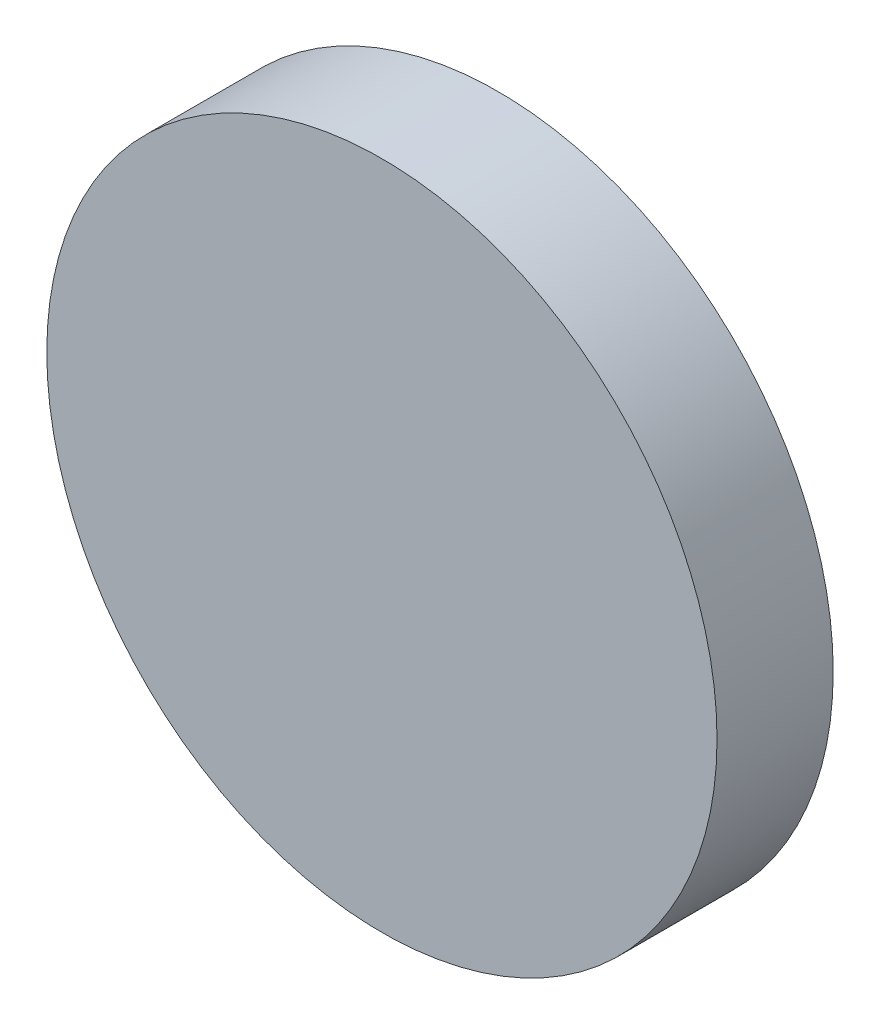
ISO-10303-21;
HEADER;
FILE_DESCRIPTION(('STEP AP214'),'2;1');
FILE_NAME('part.step','',(''),(''),'','','');
FILE_SCHEMA(('AUTOMOTIVE_DESIGN { 1 0 10303 214 1 1 1 1 }'));
ENDSEC;
DATA;
#1=APPLICATION_CONTEXT('core data for automotive mechanical design processes');
#2=APPLICATION_PROTOCOL_DEFINITION('international standard','automotive_design',2000,#1);
#3=PRODUCT_CONTEXT('',#1,'mechanical');
#4=PRODUCT('Part','Part','',(#3));
#5=PRODUCT_RELATED_PRODUCT_CATEGORY('part','',(#4));
#6=PRODUCT_DEFINITION_FORMATION('','',#4);
#7=PRODUCT_DEFINITION_CONTEXT('part definition',#1,'design');
#8=PRODUCT_DEFINITION('design','',#6,#7);
#9=PRODUCT_DEFINITION_SHAPE('','',#8);
#10=(LENGTH_UNIT() NAMED_UNIT(*) SI_UNIT(.MILLI.,.METRE.));
#11=(NAMED_UNIT(*) PLANE_ANGLE_UNIT() SI_UNIT($,.RADIAN.));
#12=(NAMED_UNIT(*) SI_UNIT($,.STERADIAN.) SOLID_ANGLE_UNIT());
#13=UNCERTAINTY_MEASURE_WITH_UNIT(LENGTH_MEASURE(1.E-05),#10,'distance_accuracy_value','');
#14=(GEOMETRIC_REPRESENTATION_CONTEXT(3) GLOBAL_UNCERTAINTY_ASSIGNED_CONTEXT((#13)) GLOBAL_UNIT_ASSIGNED_CONTEXT((#10,
#11,#12)) REPRESENTATION_CONTEXT('',''));
#15=CARTESIAN_POINT('',(0.,0.,0.));
#16=DIRECTION('',(0.,0.,1.));
#17=DIRECTION('',(1.,0.,0.));
#18=AXIS2_PLACEMENT_3D('',#15,#16,#17);
#19=CARTESIAN_POINT('',(0.,0.,3.81));
#20=DIRECTION('',(0.,0.,-1.));
#21=DIRECTION('',(-1.,0.,0.));
#22=AXIS2_PLACEMENT_3D('',#19,#20,#21);
#23=CYLINDRICAL_SURFACE('',#22,47.625);
#24=CARTESIAN_POINT('',(0.,0.,3.81));
#25=DIRECTION('',(0.,0.,1.));
#26=DIRECTION('',(1.,0.,0.));
#27=AXIS2_PLACEMENT_3D('',#24,#25,#26);
#28=CIRCLE('',#27,47.625);
#29=CARTESIAN_POINT('',(-47.625,0.,3.81));
#30=VERTEX_POINT('',#29);
#31=EDGE_CURVE('E10',#30,#30,#28,.T.);
#32=CARTESIAN_POINT('',(0.,0.,-12.7));
#33=DIRECTION('',(0.,0.,-1.));
#34=DIRECTION('',(-1.,0.,0.));
#35=AXIS2_PLACEMENT_3D('',#32,#33,#34);
#36=CIRCLE('',#35,47.625);
#37=CARTESIAN_POINT('',(-47.625,0.,-12.7));
#38=VERTEX_POINT('',#37);
#39=EDGE_CURVE('E39',#38,#38,#36,.T.);
#40=CARTESIAN_POINT('',(-47.625,0.,3.81));
#41=CARTESIAN_POINT('',(-47.625,0.,3.63802083333333));
#42=CARTESIAN_POINT('',(-47.625,0.,3.46604166666667));
#43=CARTESIAN_POINT('',(-47.625,0.,3.12208333333333));
#44=CARTESIAN_POINT('',(-47.625,0.,2.95010416666667));
#45=CARTESIAN_POINT('',(-47.625,0.,2.60614583333333));
#46=CARTESIAN_POINT('',(-47.625,0.,2.43416666666667));
#47=CARTESIAN_POINT('',(-47.625,0.,2.09020833333333));
#48=CARTESIAN_POINT('',(-47.625,0.,1.91822916666667));
#49=CARTESIAN_POINT('',(-47.625,0.,1.57427083333333));
#50=CARTESIAN_POINT('',(-47.625,0.,1.40229166666667));
#51=CARTESIAN_POINT('',(-47.625,0.,1.05833333333333));
#52=CARTESIAN_POINT('',(-47.625,0.,0.886354166666666));
#53=CARTESIAN_POINT('',(-47.625,0.,0.542395833333332));
#54=CARTESIAN_POINT('',(-47.625,0.,0.370416666666665));
#55=CARTESIAN_POINT('',(-47.625,0.,0.0264583333333322));
#56=CARTESIAN_POINT('',(-47.625,0.,-0.145520833333334));
#57=CARTESIAN_POINT('',(-47.625,0.,-0.489479166666667));
#58=CARTESIAN_POINT('',(-47.625,0.,-0.661458333333334));
#59=CARTESIAN_POINT('',(-47.625,0.,-1.00541666666667));
#60=CARTESIAN_POINT('',(-47.625,0.,-1.17739583333333));
#61=CARTESIAN_POINT('',(-47.625,0.,-1.52135416666667));
#62=CARTESIAN_POINT('',(-47.625,0.,-1.69333333333333));
#63=CARTESIAN_POINT('',(-47.625,0.,-2.03729166666667));
#64=CARTESIAN_POINT('',(-47.625,0.,-2.20927083333333));
#65=CARTESIAN_POINT('',(-47.625,0.,-2.55322916666667));
#66=CARTESIAN_POINT('',(-47.625,0.,-2.72520833333333));
#67=CARTESIAN_POINT('',(-47.625,0.,-3.06916666666667));
#68=CARTESIAN_POINT('',(-47.625,0.,-3.24114583333333));
#69=CARTESIAN_POINT('',(-47.625,0.,-3.58510416666667));
#70=CARTESIAN_POINT('',(-47.625,0.,-3.75708333333334));
#71=CARTESIAN_POINT('',(-47.625,0.,-4.10104166666667));
#72=CARTESIAN_POINT('',(-47.625,0.,-4.27302083333333));
#73=CARTESIAN_POINT('',(-47.625,0.,-4.61697916666667));
#74=CARTESIAN_POINT('',(-47.625,0.,-4.78895833333334));
#75=CARTESIAN_POINT('',(-47.625,0.,-5.13291666666667));
#76=CARTESIAN_POINT('',(-47.625,0.,-5.30489583333333));
#77=CARTESIAN_POINT('',(-47.625,0.,-5.64885416666667));
#78=CARTESIAN_POINT('',(-47.625,0.,-5.82083333333333));
#79=CARTESIAN_POINT('',(-47.625,0.,-6.16479166666667));
#80=CARTESIAN_POINT('',(-47.625,0.,-6.33677083333333));
#81=CARTESIAN_POINT('',(-47.625,0.,-6.68072916666667));
#82=CARTESIAN_POINT('',(-47.625,0.,-6.85270833333333));
#83=CARTESIAN_POINT('',(-47.625,0.,-7.19666666666667));
#84=CARTESIAN_POINT('',(-47.625,0.,-7.36864583333334));
#85=CARTESIAN_POINT('',(-47.625,0.,-7.71260416666667));
#86=CARTESIAN_POINT('',(-47.625,0.,-7.88458333333334));
#87=CARTESIAN_POINT('',(-47.625,0.,-8.22854166666667));
#88=CARTESIAN_POINT('',(-47.625,0.,-8.40052083333333));
#89=CARTESIAN_POINT('',(-47.625,0.,-8.74447916666667));
#90=CARTESIAN_POINT('',(-47.625,0.,-8.91645833333333));
#91=CARTESIAN_POINT('',(-47.625,0.,-9.26041666666667));
#92=CARTESIAN_POINT('',(-47.625,0.,-9.43239583333334));
#93=CARTESIAN_POINT('',(-47.625,0.,-9.77635416666667));
#94=CARTESIAN_POINT('',(-47.625,0.,-9.94833333333334));
#95=CARTESIAN_POINT('',(-47.625,0.,-10.2922916666667));
#96=CARTESIAN_POINT('',(-47.625,0.,-10.4642708333333));
#97=CARTESIAN_POINT('',(-47.625,0.,-10.8082291666667));
#98=CARTESIAN_POINT('',(-47.625,0.,-10.9802083333333));
#99=CARTESIAN_POINT('',(-47.625,0.,-11.3241666666667));
#100=CARTESIAN_POINT('',(-47.625,0.,-11.4961458333333));
#101=CARTESIAN_POINT('',(-47.625,0.,-11.8401041666667));
#102=CARTESIAN_POINT('',(-47.625,0.,-12.0120833333333));
#103=CARTESIAN_POINT('',(-47.625,0.,-12.3560416666667));
#104=CARTESIAN_POINT('',(-47.625,0.,-12.5280208333333));
#105=CARTESIAN_POINT('',(-47.625,0.,-12.7));
#106=B_SPLINE_CURVE_WITH_KNOTS('',3,(#40,#41,#42,#43,#44,#45,#46,#47,#48,#49,#50,#51,#52,#53,
#54,#55,#56,#57,#58,#59,#60,#61,#62,#63,#64,#65,#66,#67,#68,#69,#70,#71,#72,#73,#74,#75,#76,#77,
#78,#79,#80,#81,#82,#83,#84,#85,#86,#87,#88,#89,#90,#91,#92,#93,#94,#95,#96,#97,#98,#99,#100,
#101,#102,#103,#104,#105),.UNSPECIFIED.,.F.,.F.,(4,2,2,2,2,2,2,2,2,2,2,2,2,2,2,2,2,2,2,2,2,2,2,
2,2,2,2,2,2,2,2,2,4),(0.,0.5159375,1.031875,1.5478125,2.06375,2.5796875,3.095625,3.6115625,
4.1275,4.6434375,5.159375,5.6753125,6.19125,6.7071875,7.223125,7.7390625,8.255,8.7709375,
9.286875,9.8028125,10.31875,10.8346875,11.350625,11.8665625,12.3825,12.8984375,13.414375,
13.9303125,14.44625,14.9621875,15.478125,15.9940625,16.51),.UNSPECIFIED.);
#107=EDGE_CURVE('BSEAM33',#30,#38,#106,.T.);
#108=ORIENTED_EDGE('',*,*,#31,.F.);
#109=ORIENTED_EDGE('',*,*,#39,.F.);
#110=ORIENTED_EDGE('',*,*,#107,.T.);
#111=ORIENTED_EDGE('',*,*,#107,.F.);
#112=EDGE_LOOP('',(#108,#110,#109,#111));
#113=FACE_BOUND('',#112,.T.);
#114=ADVANCED_FACE('F33',(#113),#23,.T.);
#115=CARTESIAN_POINT('',(0.,0.,3.81));
#116=DIRECTION('',(0.,0.,1.));
#117=DIRECTION('',(1.,0.,0.));
#118=AXIS2_PLACEMENT_3D('',#115,#116,#117);
#119=PLANE('',#118);
#120=ORIENTED_EDGE('',*,*,#31,.T.);
#121=EDGE_LOOP('',(#120));
#122=FACE_BOUND('',#121,.T.);
#123=ADVANCED_FACE('F64',(#122),#119,.T.);
#124=CARTESIAN_POINT('',(0.,0.,-12.7));
#125=DIRECTION('',(0.,0.,-1.));
#126=DIRECTION('',(-1.,0.,0.));
#127=AXIS2_PLACEMENT_3D('',#124,#125,#126);
#128=PLANE('',#127);
#129=ORIENTED_EDGE('',*,*,#39,.T.);
#130=EDGE_LOOP('',(#129));
#131=FACE_BOUND('',#130,.T.);
#132=CARTESIAN_POINT('',(0.,0.,-12.7));
#133=DIRECTION('',(0.,0.,-1.));
#134=DIRECTION('',(-1.,0.,0.));
#135=AXIS2_PLACEMENT_3D('',#132,#133,#134);
#136=CIRCLE('',#135,44.45);
#137=CARTESIAN_POINT('',(44.45,0.,-12.7));
#138=VERTEX_POINT('',#137);
#139=EDGE_CURVE('E43',#138,#138,#136,.T.);
#140=ORIENTED_EDGE('',*,*,#139,.F.);
#141=EDGE_LOOP('',(#140));
#142=FACE_BOUND('',#141,.T.);
#143=ADVANCED_FACE('F57',(#131,#142),#128,.T.);
#144=CARTESIAN_POINT('',(0.,0.,-12.7));
#145=DIRECTION('',(0.,0.,1.));
#146=DIRECTION('',(1.,0.,0.));
#147=AXIS2_PLACEMENT_3D('',#144,#145,#146);
#148=CYLINDRICAL_SURFACE('',#147,44.45);
#149=CARTESIAN_POINT('',(0.,0.,0.));
#150=DIRECTION('',(0.,0.,-1.));
#151=DIRECTION('',(-1.,0.,0.));
#152=AXIS2_PLACEMENT_3D('',#149,#150,#151);
#153=CIRCLE('',#152,44.45);
#154=CARTESIAN_POINT('',(44.45,0.,0.));
#155=VERTEX_POINT('',#154);
#156=EDGE_CURVE('E47',#155,#155,#153,.T.);
#157=CARTESIAN_POINT('',(44.45,0.,-12.7));
#158=CARTESIAN_POINT('',(44.45,0.,-12.5677083333333));
#159=CARTESIAN_POINT('',(44.45,0.,-12.4354166666667));
#160=CARTESIAN_POINT('',(44.45,0.,-12.1708333333333));
#161=CARTESIAN_POINT('',(44.45,0.,-12.0385416666667));
#162=CARTESIAN_POINT('',(44.45,0.,-11.7739583333333));
#163=CARTESIAN_POINT('',(44.45,0.,-11.6416666666667));
#164=CARTESIAN_POINT('',(44.45,0.,-11.3770833333333));
#165=CARTESIAN_POINT('',(44.45,0.,-11.2447916666667));
#166=CARTESIAN_POINT('',(44.45,0.,-10.9802083333333));
#167=CARTESIAN_POINT('',(44.45,0.,-10.8479166666667));
#168=CARTESIAN_POINT('',(44.45,0.,-10.5833333333333));
#169=CARTESIAN_POINT('',(44.45,0.,-10.4510416666667));
#170=CARTESIAN_POINT('',(44.45,0.,-10.1864583333333));
#171=CARTESIAN_POINT('',(44.45,0.,-10.0541666666667));
#172=CARTESIAN_POINT('',(44.45,0.,-9.78958333333333));
#173=CARTESIAN_POINT('',(44.45,0.,-9.65729166666667));
#174=CARTESIAN_POINT('',(44.45,0.,-9.39270833333333));
#175=CARTESIAN_POINT('',(44.45,0.,-9.26041666666667));
#176=CARTESIAN_POINT('',(44.45,0.,-8.99583333333334));
#177=CARTESIAN_POINT('',(44.45,0.,-8.86354166666667));
#178=CARTESIAN_POINT('',(44.45,0.,-8.59895833333334));
#179=CARTESIAN_POINT('',(44.45,0.,-8.46666666666667));
#180=CARTESIAN_POINT('',(44.45,0.,-8.20208333333333));
#181=CARTESIAN_POINT('',(44.45,0.,-8.06979166666667));
#182=CARTESIAN_POINT('',(44.45,0.,-7.80520833333333));
#183=CARTESIAN_POINT('',(44.45,0.,-7.67291666666667));
#184=CARTESIAN_POINT('',(44.45,0.,-7.40833333333333));
#185=CARTESIAN_POINT('',(44.45,0.,-7.27604166666667));
#186=CARTESIAN_POINT('',(44.45,0.,-7.01145833333333));
#187=CARTESIAN_POINT('',(44.45,0.,-6.87916666666667));
#188=CARTESIAN_POINT('',(44.45,0.,-6.61458333333333));
#189=CARTESIAN_POINT('',(44.45,0.,-6.48229166666667));
#190=CARTESIAN_POINT('',(44.45,0.,-6.21770833333333));
#191=CARTESIAN_POINT('',(44.45,0.,-6.08541666666667));
#192=CARTESIAN_POINT('',(44.45,0.,-5.82083333333333));
#193=CARTESIAN_POINT('',(44.45,0.,-5.68854166666667));
#194=CARTESIAN_POINT('',(44.45,0.,-5.42395833333333));
#195=CARTESIAN_POINT('',(44.45,0.,-5.29166666666667));
#196=CARTESIAN_POINT('',(44.45,0.,-5.02708333333333));
#197=CARTESIAN_POINT('',(44.45,0.,-4.89479166666667));
#198=CARTESIAN_POINT('',(44.45,0.,-4.63020833333333));
#199=CARTESIAN_POINT('',(44.45,0.,-4.49791666666667));
#200=CARTESIAN_POINT('',(44.45,0.,-4.23333333333333));
#201=CARTESIAN_POINT('',(44.45,0.,-4.10104166666667));
#202=CARTESIAN_POINT('',(44.45,0.,-3.83645833333333));
#203=CARTESIAN_POINT('',(44.45,0.,-3.70416666666667));
#204=CARTESIAN_POINT('',(44.45,0.,-3.43958333333333));
#205=CARTESIAN_POINT('',(44.45,0.,-3.30729166666667));
#206=CARTESIAN_POINT('',(44.45,0.,-3.04270833333333));
#207=CARTESIAN_POINT('',(44.45,0.,-2.91041666666667));
#208=CARTESIAN_POINT('',(44.45,0.,-2.64583333333333));
#209=CARTESIAN_POINT('',(44.45,0.,-2.51354166666667));
#210=CARTESIAN_POINT('',(44.45,0.,-2.24895833333333));
#211=CARTESIAN_POINT('',(44.45,0.,-2.11666666666667));
#212=CARTESIAN_POINT('',(44.45,0.,-1.85208333333333));
#213=CARTESIAN_POINT('',(44.45,0.,-1.71979166666667));
#214=CARTESIAN_POINT('',(44.45,0.,-1.45520833333333));
#215=CARTESIAN_POINT('',(44.45,0.,-1.32291666666667));
#216=CARTESIAN_POINT('',(44.45,0.,-1.05833333333333));
#217=CARTESIAN_POINT('',(44.45,0.,-0.926041666666666));
#218=CARTESIAN_POINT('',(44.45,0.,-0.661458333333333));
#219=CARTESIAN_POINT('',(44.45,0.,-0.529166666666666));
#220=CARTESIAN_POINT('',(44.45,0.,-0.264583333333333));
#221=CARTESIAN_POINT('',(44.45,0.,-0.132291666666667));
#222=CARTESIAN_POINT('',(44.45,0.,0.));
#223=B_SPLINE_CURVE_WITH_KNOTS('',3,(#157,#158,#159,#160,#161,#162,#163,#164,#165,#166,#167,
#168,#169,#170,#171,#172,#173,#174,#175,#176,#177,#178,#179,#180,#181,#182,#183,#184,#185,#186,
#187,#188,#189,#190,#191,#192,#193,#194,#195,#196,#197,#198,#199,#200,#201,#202,#203,#204,#205,
#206,#207,#208,#209,#210,#211,#212,#213,#214,#215,#216,#217,#218,#219,#220,#221,#222),
.UNSPECIFIED.,.F.,.F.,(4,2,2,2,2,2,2,2,2,2,2,2,2,2,2,2,2,2,2,2,2,2,2,2,2,2,2,2,2,2,2,2,4),(0.,
0.396875,0.793749999999999,1.190625,1.5875,1.984375,2.38125,2.778125,3.175,3.571875,3.96875,
4.365625,4.7625,5.159375,5.55625,5.953125,6.35,6.746875,7.14375,7.540625,7.9375,8.334375,
8.73125,9.128125,9.525,9.921875,10.31875,10.715625,11.1125,11.509375,11.90625,12.303125,12.7),.UNSPECIFIED.);
#224=EDGE_CURVE('BSEAM55',#138,#155,#223,.T.);
#225=ORIENTED_EDGE('',*,*,#139,.T.);
#226=ORIENTED_EDGE('',*,*,#156,.F.);
#227=ORIENTED_EDGE('',*,*,#224,.T.);
#228=ORIENTED_EDGE('',*,*,#224,.F.);
#229=EDGE_LOOP('',(#225,#227,#226,#228));
#230=FACE_BOUND('',#229,.T.);
#231=ADVANCED_FACE('F55',(#230),#148,.F.);
#232=CARTESIAN_POINT('',(0.,0.,0.));
#233=DIRECTION('',(0.,0.,1.));
#234=DIRECTION('',(1.,0.,0.));
#235=AXIS2_PLACEMENT_3D('',#232,#233,#234);
#236=PLANE('',#235);
#237=ORIENTED_EDGE('',*,*,#156,.T.);
#238=EDGE_LOOP('',(#237));
#239=FACE_BOUND('',#238,.T.);
#240=ADVANCED_FACE('F53',(#239),#236,.F.);
#241=CLOSED_SHELL('',(#114,#123,#143,#231,#240));
#242=MANIFOLD_SOLID_BREP('B2',#241);
#243=ADVANCED_BREP_SHAPE_REPRESENTATION('',(#18,#242),#14);
#244=SHAPE_DEFINITION_REPRESENTATION(#9,#243);
ENDSEC;
END-ISO-10303-21;
